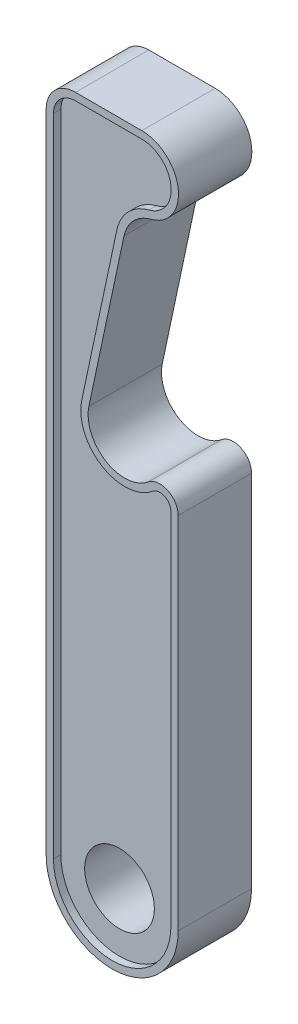
ISO-10303-21;
HEADER;
FILE_DESCRIPTION(('STEP AP214'),'2;1');
FILE_NAME('part.step','',(''),(''),'','','');
FILE_SCHEMA(('AUTOMOTIVE_DESIGN { 1 0 10303 214 1 1 1 1 }'));
ENDSEC;
DATA;
#1=APPLICATION_CONTEXT('core data for automotive mechanical design processes');
#2=APPLICATION_PROTOCOL_DEFINITION('international standard','automotive_design',2000,#1);
#3=PRODUCT_CONTEXT('',#1,'mechanical');
#4=PRODUCT('Part','Part','',(#3));
#5=PRODUCT_RELATED_PRODUCT_CATEGORY('part','',(#4));
#6=PRODUCT_DEFINITION_FORMATION('','',#4);
#7=PRODUCT_DEFINITION_CONTEXT('part definition',#1,'design');
#8=PRODUCT_DEFINITION('design','',#6,#7);
#9=PRODUCT_DEFINITION_SHAPE('','',#8);
#10=(LENGTH_UNIT() NAMED_UNIT(*) SI_UNIT(.MILLI.,.METRE.));
#11=(NAMED_UNIT(*) PLANE_ANGLE_UNIT() SI_UNIT($,.RADIAN.));
#12=(NAMED_UNIT(*) SI_UNIT($,.STERADIAN.) SOLID_ANGLE_UNIT());
#13=UNCERTAINTY_MEASURE_WITH_UNIT(LENGTH_MEASURE(1.E-05),#10,'distance_accuracy_value','');
#14=(GEOMETRIC_REPRESENTATION_CONTEXT(3) GLOBAL_UNCERTAINTY_ASSIGNED_CONTEXT((#13)) GLOBAL_UNIT_ASSIGNED_CONTEXT((#10,
#11,#12)) REPRESENTATION_CONTEXT('',''));
#15=CARTESIAN_POINT('',(0.,0.,0.));
#16=DIRECTION('',(0.,0.,1.));
#17=DIRECTION('',(1.,0.,0.));
#18=AXIS2_PLACEMENT_3D('',#15,#16,#17);
#19=CARTESIAN_POINT('',(0.,0.,4.5));
#20=DIRECTION('',(0.,0.,-1.));
#21=DIRECTION('',(-1.,0.,0.));
#22=AXIS2_PLACEMENT_3D('',#19,#20,#21);
#23=CYLINDRICAL_SURFACE('',#22,4.75);
#24=CARTESIAN_POINT('',(0.,0.,4.5));
#25=DIRECTION('',(0.,0.,1.));
#26=DIRECTION('',(1.,0.,0.));
#27=AXIS2_PLACEMENT_3D('',#24,#25,#26);
#28=CIRCLE('',#27,4.75);
#29=CARTESIAN_POINT('',(4.75,0.,4.5));
#30=VERTEX_POINT('',#29);
#31=EDGE_CURVE('E370',#30,#30,#28,.T.);
#32=ORIENTED_EDGE('',*,*,#31,.T.);
#33=EDGE_LOOP('',(#32));
#34=FACE_BOUND('',#33,.T.);
#35=CARTESIAN_POINT('',(0.,0.,-4.5));
#36=DIRECTION('',(0.,0.,1.));
#37=DIRECTION('',(1.,0.,0.));
#38=AXIS2_PLACEMENT_3D('',#35,#36,#37);
#39=CIRCLE('',#38,4.75);
#40=CARTESIAN_POINT('',(4.75,0.,-4.5));
#41=VERTEX_POINT('',#40);
#42=EDGE_CURVE('E102',#41,#41,#39,.T.);
#43=ORIENTED_EDGE('',*,*,#42,.F.);
#44=EDGE_LOOP('',(#43));
#45=FACE_BOUND('',#44,.T.);
#46=ADVANCED_FACE('F99',(#34,#45),#23,.F.);
#47=CARTESIAN_POINT('',(0.,0.,4.5));
#48=DIRECTION('',(0.,0.,1.));
#49=DIRECTION('',(1.,0.,0.));
#50=AXIS2_PLACEMENT_3D('',#47,#48,#49);
#51=PLANE('',#50);
#52=ORIENTED_EDGE('',*,*,#31,.F.);
#53=EDGE_LOOP('',(#52));
#54=FACE_BOUND('',#53,.T.);
#55=DIRECTION('',(0.,1.,0.));
#56=VECTOR('',#55,1.);
#57=CARTESIAN_POINT('',(-8.,0.,4.5));
#58=LINE('',#57,#56);
#59=CARTESIAN_POINT('',(-8.,0.,4.5));
#60=VERTEX_POINT('',#59);
#61=CARTESIAN_POINT('',(-8.,88.,4.5));
#62=VERTEX_POINT('',#61);
#63=EDGE_CURVE('E373',#60,#62,#58,.T.);
#64=ORIENTED_EDGE('',*,*,#63,.F.);
#65=CARTESIAN_POINT('',(0.,0.,4.5));
#66=DIRECTION('',(0.,0.,1.));
#67=DIRECTION('',(1.,0.,0.));
#68=AXIS2_PLACEMENT_3D('',#65,#66,#67);
#69=CIRCLE('',#68,8.);
#70=CARTESIAN_POINT('',(8.,0.,4.5));
#71=VERTEX_POINT('',#70);
#72=EDGE_CURVE('E375',#60,#71,#69,.T.);
#73=ORIENTED_EDGE('',*,*,#72,.T.);
#74=DIRECTION('',(0.,1.,0.));
#75=VECTOR('',#74,1.);
#76=CARTESIAN_POINT('',(8.,0.,4.5));
#77=LINE('',#76,#75);
#78=CARTESIAN_POINT('',(7.99999999999999,49.0303312216235,4.5));
#79=VERTEX_POINT('',#78);
#80=EDGE_CURVE('E378',#71,#79,#77,.T.);
#81=ORIENTED_EDGE('',*,*,#80,.T.);
#82=CARTESIAN_POINT('',(6.49999999999999,49.0303312216235,4.5));
#83=DIRECTION('',(0.,0.,1.));
#84=DIRECTION('',(1.,0.,0.));
#85=AXIS2_PLACEMENT_3D('',#82,#83,#84);
#86=CIRCLE('',#85,1.5);
#87=CARTESIAN_POINT('',(5.54349547248489,50.185796101593,4.5));
#88=VERTEX_POINT('',#87);
#89=EDGE_CURVE('E381',#79,#88,#86,.T.);
#90=ORIENTED_EDGE('',*,*,#89,.T.);
#91=CARTESIAN_POINT('',(1.71747736242449,54.8076556214714,4.5));
#92=DIRECTION('',(0.,0.,1.));
#93=DIRECTION('',(1.,0.,0.));
#94=AXIS2_PLACEMENT_3D('',#91,#92,#93);
#95=CIRCLE('',#94,6.);
#96=CARTESIAN_POINT('',(-4.15140824197834,56.0551257663779,4.5));
#97=VERTEX_POINT('',#96);
#98=EDGE_CURVE('E122',#88,#97,#95,.F.);
#99=ORIENTED_EDGE('',*,*,#98,.T.);
#100=DIRECTION('',(0.20791169081776,0.978147600733806,0.));
#101=VECTOR('',#100,1.);
#102=CARTESIAN_POINT('',(-15.3717910328331,3.26737504864908,4.5));
#103=LINE('',#102,#101);
#104=CARTESIAN_POINT('',(0.631114395597164,78.5551257663779,4.5));
#105=VERTEX_POINT('',#104);
#106=EDGE_CURVE('E384',#97,#105,#103,.T.);
#107=ORIENTED_EDGE('',*,*,#106,.T.);
#108=CARTESIAN_POINT('',(6.49999999999999,77.3076556214714,4.5));
#109=DIRECTION('',(0.,0.,1.));
#110=DIRECTION('',(1.,0.,0.));
#111=AXIS2_PLACEMENT_3D('',#108,#109,#110);
#112=CIRCLE('',#111,5.99999999999999);
#113=CARTESIAN_POINT('',(5.02316359698118,83.1230622485886,4.5));
#114=VERTEX_POINT('',#113);
#115=EDGE_CURVE('E387',#105,#114,#112,.F.);
#116=ORIENTED_EDGE('',*,*,#115,.T.);
#117=CARTESIAN_POINT('',(4.03860599496866,87.,4.5));
#118=DIRECTION('',(0.,0.,1.));
#119=DIRECTION('',(1.,0.,0.));
#120=AXIS2_PLACEMENT_3D('',#117,#118,#119);
#121=CIRCLE('',#120,3.99999999999999);
#122=CARTESIAN_POINT('',(4.03860599496866,91.,4.5));
#123=VERTEX_POINT('',#122);
#124=EDGE_CURVE('E390',#114,#123,#121,.T.);
#125=ORIENTED_EDGE('',*,*,#124,.T.);
#126=DIRECTION('',(1.,0.,0.));
#127=VECTOR('',#126,1.);
#128=CARTESIAN_POINT('',(0.,91.,4.5));
#129=LINE('',#128,#127);
#130=CARTESIAN_POINT('',(-5.,91.,4.5));
#131=VERTEX_POINT('',#130);
#132=EDGE_CURVE('E107',#131,#123,#129,.T.);
#133=ORIENTED_EDGE('',*,*,#132,.F.);
#134=CARTESIAN_POINT('',(-5.,88.,4.5));
#135=DIRECTION('',(0.,0.,1.));
#136=DIRECTION('',(1.,0.,0.));
#137=AXIS2_PLACEMENT_3D('',#134,#135,#136);
#138=CIRCLE('',#137,3.);
#139=EDGE_CURVE('E12',#62,#131,#138,.F.);
#140=ORIENTED_EDGE('',*,*,#139,.F.);
#141=EDGE_LOOP('',(#64,#73,#81,#90,#99,#107,#116,#125,#133,#140));
#142=FACE_BOUND('',#141,.T.);
#143=ADVANCED_FACE('F404',(#54,#142),#51,.T.);
#144=CARTESIAN_POINT('',(0.,0.,-4.5));
#145=DIRECTION('',(0.,0.,1.));
#146=DIRECTION('',(1.,0.,0.));
#147=AXIS2_PLACEMENT_3D('',#144,#145,#146);
#148=PLANE('',#147);
#149=ORIENTED_EDGE('',*,*,#42,.T.);
#150=EDGE_LOOP('',(#149));
#151=FACE_BOUND('',#150,.T.);
#152=CARTESIAN_POINT('',(4.03860599496866,87.,-4.5));
#153=DIRECTION('',(0.,0.,1.));
#154=DIRECTION('',(1.,0.,0.));
#155=AXIS2_PLACEMENT_3D('',#152,#153,#154);
#156=CIRCLE('',#155,5.);
#157=CARTESIAN_POINT('',(5.26930299748432,82.1538278107357,-4.5));
#158=VERTEX_POINT('',#157);
#159=CARTESIAN_POINT('',(4.03860599496866,92.,-4.5));
#160=VERTEX_POINT('',#159);
#161=EDGE_CURVE('E248',#158,#160,#156,.T.);
#162=ORIENTED_EDGE('',*,*,#161,.F.);
#163=CARTESIAN_POINT('',(6.49999999999999,77.3076556214714,-4.5));
#164=DIRECTION('',(0.,0.,1.));
#165=DIRECTION('',(1.,0.,0.));
#166=AXIS2_PLACEMENT_3D('',#163,#164,#165);
#167=CIRCLE('',#166,5.);
#168=CARTESIAN_POINT('',(1.60926199633096,78.3472140755602,-4.5));
#169=VERTEX_POINT('',#168);
#170=EDGE_CURVE('E300',#158,#169,#167,.T.);
#171=ORIENTED_EDGE('',*,*,#170,.T.);
#172=DIRECTION('',(0.207911690817759,0.978147600733806,0.));
#173=VECTOR('',#172,1.);
#174=CARTESIAN_POINT('',(-14.3936434320992,3.05946335783131,-4.5));
#175=LINE('',#174,#173);
#176=CARTESIAN_POINT('',(-3.17326064124454,55.8472140755602,-4.5));
#177=VERTEX_POINT('',#176);
#178=EDGE_CURVE('E344',#177,#169,#175,.T.);
#179=ORIENTED_EDGE('',*,*,#178,.F.);
#180=CARTESIAN_POINT('',(1.71747736242449,54.8076556214714,-4.5));
#181=DIRECTION('',(0.,0.,1.));
#182=DIRECTION('',(1.,0.,0.));
#183=AXIS2_PLACEMENT_3D('',#180,#181,#182);
#184=CIRCLE('',#183,5.);
#185=CARTESIAN_POINT('',(4.90582578747482,50.9561060215728,-4.5));
#186=VERTEX_POINT('',#185);
#187=EDGE_CURVE('E341',#177,#186,#184,.T.);
#188=ORIENTED_EDGE('',*,*,#187,.T.);
#189=CARTESIAN_POINT('',(6.49999999999999,49.0303312216235,-4.5));
#190=DIRECTION('',(0.,0.,1.));
#191=DIRECTION('',(1.,0.,0.));
#192=AXIS2_PLACEMENT_3D('',#189,#190,#191);
#193=CIRCLE('',#192,2.5);
#194=CARTESIAN_POINT('',(8.99999999999999,49.0303312216235,-4.5));
#195=VERTEX_POINT('',#194);
#196=EDGE_CURVE('E338',#195,#186,#193,.T.);
#197=ORIENTED_EDGE('',*,*,#196,.F.);
#198=DIRECTION('',(0.,1.,0.));
#199=VECTOR('',#198,1.);
#200=CARTESIAN_POINT('',(9.,0.,-4.5));
#201=LINE('',#200,#199);
#202=CARTESIAN_POINT('',(9.,0.,-4.5));
#203=VERTEX_POINT('',#202);
#204=EDGE_CURVE('E336',#203,#195,#201,.T.);
#205=ORIENTED_EDGE('',*,*,#204,.F.);
#206=CARTESIAN_POINT('',(0.,0.,-4.5));
#207=DIRECTION('',(0.,0.,1.));
#208=DIRECTION('',(1.,0.,0.));
#209=AXIS2_PLACEMENT_3D('',#206,#207,#208);
#210=CIRCLE('',#209,9.);
#211=CARTESIAN_POINT('',(-9.,0.,-4.5));
#212=VERTEX_POINT('',#211);
#213=EDGE_CURVE('E334',#212,#203,#210,.T.);
#214=ORIENTED_EDGE('',*,*,#213,.F.);
#215=DIRECTION('',(0.,1.,0.));
#216=VECTOR('',#215,1.);
#217=CARTESIAN_POINT('',(-9.,0.,-4.5));
#218=LINE('',#217,#216);
#219=CARTESIAN_POINT('',(-9.,88.,-4.5));
#220=VERTEX_POINT('',#219);
#221=EDGE_CURVE('E331',#212,#220,#218,.T.);
#222=ORIENTED_EDGE('',*,*,#221,.T.);
#223=CARTESIAN_POINT('',(-5.,88.,-4.5));
#224=DIRECTION('',(0.,0.,1.));
#225=DIRECTION('',(1.,0.,0.));
#226=AXIS2_PLACEMENT_3D('',#223,#224,#225);
#227=CIRCLE('',#226,4.);
#228=CARTESIAN_POINT('',(-5.,92.,-4.5));
#229=VERTEX_POINT('',#228);
#230=EDGE_CURVE('E328',#229,#220,#227,.T.);
#231=ORIENTED_EDGE('',*,*,#230,.F.);
#232=DIRECTION('',(1.,0.,0.));
#233=VECTOR('',#232,1.);
#234=CARTESIAN_POINT('',(-1.41255905947182E-13,92.,-4.5));
#235=LINE('',#234,#233);
#236=EDGE_CURVE('E325',#229,#160,#235,.T.);
#237=ORIENTED_EDGE('',*,*,#236,.T.);
#238=EDGE_LOOP('',(#162,#171,#179,#188,#197,#205,#214,#222,#231,#237));
#239=FACE_BOUND('',#238,.T.);
#240=ADVANCED_FACE('F435',(#151,#239),#148,.F.);
#241=CARTESIAN_POINT('',(4.03860599496866,87.,5.5));
#242=DIRECTION('',(0.,0.,1.));
#243=DIRECTION('',(1.,0.,0.));
#244=AXIS2_PLACEMENT_3D('',#241,#242,#243);
#245=PLANE('',#244);
#246=CARTESIAN_POINT('',(4.03860599496866,87.,5.5));
#247=DIRECTION('',(0.,0.,1.));
#248=DIRECTION('',(1.,0.,0.));
#249=AXIS2_PLACEMENT_3D('',#246,#247,#248);
#250=CIRCLE('',#249,5.);
#251=CARTESIAN_POINT('',(5.26930299748432,82.1538278107357,5.5));
#252=VERTEX_POINT('',#251);
#253=CARTESIAN_POINT('',(4.03860599496866,92.,5.5));
#254=VERTEX_POINT('',#253);
#255=EDGE_CURVE('E297',#252,#254,#250,.T.);
#256=ORIENTED_EDGE('',*,*,#255,.T.);
#257=DIRECTION('',(1.,0.,0.));
#258=VECTOR('',#257,1.);
#259=CARTESIAN_POINT('',(-1.41255905947182E-13,92.,5.5));
#260=LINE('',#259,#258);
#261=CARTESIAN_POINT('',(-5.,92.,5.5));
#262=VERTEX_POINT('',#261);
#263=EDGE_CURVE('E299',#262,#254,#260,.T.);
#264=ORIENTED_EDGE('',*,*,#263,.F.);
#265=CARTESIAN_POINT('',(-5.,88.,5.5));
#266=DIRECTION('',(0.,0.,1.));
#267=DIRECTION('',(1.,0.,0.));
#268=AXIS2_PLACEMENT_3D('',#265,#266,#267);
#269=CIRCLE('',#268,4.);
#270=CARTESIAN_POINT('',(-9.,88.,5.5));
#271=VERTEX_POINT('',#270);
#272=EDGE_CURVE('E303',#262,#271,#269,.T.);
#273=ORIENTED_EDGE('',*,*,#272,.T.);
#274=DIRECTION('',(0.,1.,0.));
#275=VECTOR('',#274,1.);
#276=CARTESIAN_POINT('',(-9.,0.,5.5));
#277=LINE('',#276,#275);
#278=CARTESIAN_POINT('',(-9.,0.,5.5));
#279=VERTEX_POINT('',#278);
#280=EDGE_CURVE('E305',#279,#271,#277,.T.);
#281=ORIENTED_EDGE('',*,*,#280,.F.);
#282=CARTESIAN_POINT('',(0.,0.,5.5));
#283=DIRECTION('',(0.,0.,1.));
#284=DIRECTION('',(1.,0.,0.));
#285=AXIS2_PLACEMENT_3D('',#282,#283,#284);
#286=CIRCLE('',#285,9.);
#287=CARTESIAN_POINT('',(9.,0.,5.5));
#288=VERTEX_POINT('',#287);
#289=EDGE_CURVE('E308',#279,#288,#286,.T.);
#290=ORIENTED_EDGE('',*,*,#289,.T.);
#291=DIRECTION('',(0.,1.,0.));
#292=VECTOR('',#291,1.);
#293=CARTESIAN_POINT('',(9.,0.,5.5));
#294=LINE('',#293,#292);
#295=CARTESIAN_POINT('',(8.99999999999999,49.0303312216235,5.5));
#296=VERTEX_POINT('',#295);
#297=EDGE_CURVE('E310',#288,#296,#294,.T.);
#298=ORIENTED_EDGE('',*,*,#297,.T.);
#299=CARTESIAN_POINT('',(6.49999999999999,49.0303312216235,5.5));
#300=DIRECTION('',(0.,0.,1.));
#301=DIRECTION('',(1.,0.,0.));
#302=AXIS2_PLACEMENT_3D('',#299,#300,#301);
#303=CIRCLE('',#302,2.5);
#304=CARTESIAN_POINT('',(4.90582578747482,50.9561060215728,5.5));
#305=VERTEX_POINT('',#304);
#306=EDGE_CURVE('E312',#296,#305,#303,.T.);
#307=ORIENTED_EDGE('',*,*,#306,.T.);
#308=CARTESIAN_POINT('',(1.71747736242449,54.8076556214714,5.5));
#309=DIRECTION('',(0.,0.,1.));
#310=DIRECTION('',(1.,0.,0.));
#311=AXIS2_PLACEMENT_3D('',#308,#309,#310);
#312=CIRCLE('',#311,5.);
#313=CARTESIAN_POINT('',(-3.17326064124454,55.8472140755602,5.5));
#314=VERTEX_POINT('',#313);
#315=EDGE_CURVE('E314',#314,#305,#312,.T.);
#316=ORIENTED_EDGE('',*,*,#315,.F.);
#317=DIRECTION('',(0.207911690817759,0.978147600733806,0.));
#318=VECTOR('',#317,1.);
#319=CARTESIAN_POINT('',(-14.3936434320992,3.05946335783131,5.5));
#320=LINE('',#319,#318);
#321=CARTESIAN_POINT('',(1.60926199633096,78.3472140755602,5.5));
#322=VERTEX_POINT('',#321);
#323=EDGE_CURVE('E317',#314,#322,#320,.T.);
#324=ORIENTED_EDGE('',*,*,#323,.T.);
#325=CARTESIAN_POINT('',(6.49999999999999,77.3076556214714,5.5));
#326=DIRECTION('',(0.,0.,1.));
#327=DIRECTION('',(1.,0.,0.));
#328=AXIS2_PLACEMENT_3D('',#325,#326,#327);
#329=CIRCLE('',#328,5.);
#330=EDGE_CURVE('E319',#252,#322,#329,.T.);
#331=ORIENTED_EDGE('',*,*,#330,.F.);
#332=EDGE_LOOP('',(#256,#264,#273,#281,#290,#298,#307,#316,#324,#331));
#333=FACE_BOUND('',#332,.T.);
#334=CARTESIAN_POINT('',(1.71747736242449,54.8076556214714,5.5));
#335=DIRECTION('',(0.,0.,1.));
#336=DIRECTION('',(1.,0.,0.));
#337=AXIS2_PLACEMENT_3D('',#334,#335,#336);
#338=CIRCLE('',#337,6.);
#339=CARTESIAN_POINT('',(-4.15140824197834,56.0551257663779,5.5));
#340=VERTEX_POINT('',#339);
#341=CARTESIAN_POINT('',(5.54349547248489,50.185796101593,5.5));
#342=VERTEX_POINT('',#341);
#343=EDGE_CURVE('E243',#340,#342,#338,.T.);
#344=ORIENTED_EDGE('',*,*,#343,.T.);
#345=CARTESIAN_POINT('',(6.49999999999999,49.0303312216235,5.5));
#346=DIRECTION('',(0.,0.,1.));
#347=DIRECTION('',(1.,0.,0.));
#348=AXIS2_PLACEMENT_3D('',#345,#346,#347);
#349=CIRCLE('',#348,1.5);
#350=CARTESIAN_POINT('',(7.99999999999999,49.0303312216235,5.5));
#351=VERTEX_POINT('',#350);
#352=EDGE_CURVE('E236',#351,#342,#349,.T.);
#353=ORIENTED_EDGE('',*,*,#352,.F.);
#354=DIRECTION('',(0.,1.,0.));
#355=VECTOR('',#354,1.);
#356=CARTESIAN_POINT('',(8.,0.,5.5));
#357=LINE('',#356,#355);
#358=CARTESIAN_POINT('',(8.,0.,5.5));
#359=VERTEX_POINT('',#358);
#360=EDGE_CURVE('E272',#359,#351,#357,.T.);
#361=ORIENTED_EDGE('',*,*,#360,.F.);
#362=CARTESIAN_POINT('',(0.,0.,5.5));
#363=DIRECTION('',(0.,0.,1.));
#364=DIRECTION('',(1.,0.,0.));
#365=AXIS2_PLACEMENT_3D('',#362,#363,#364);
#366=CIRCLE('',#365,8.);
#367=CARTESIAN_POINT('',(-8.,0.,5.5));
#368=VERTEX_POINT('',#367);
#369=EDGE_CURVE('E269',#368,#359,#366,.T.);
#370=ORIENTED_EDGE('',*,*,#369,.F.);
#371=DIRECTION('',(0.,1.,0.));
#372=VECTOR('',#371,1.);
#373=CARTESIAN_POINT('',(-8.,0.,5.5));
#374=LINE('',#373,#372);
#375=CARTESIAN_POINT('',(-8.,88.,5.5));
#376=VERTEX_POINT('',#375);
#377=EDGE_CURVE('E266',#368,#376,#374,.T.);
#378=ORIENTED_EDGE('',*,*,#377,.T.);
#379=CARTESIAN_POINT('',(-5.,88.,5.5));
#380=DIRECTION('',(0.,0.,1.));
#381=DIRECTION('',(1.,0.,0.));
#382=AXIS2_PLACEMENT_3D('',#379,#380,#381);
#383=CIRCLE('',#382,3.);
#384=CARTESIAN_POINT('',(-5.,91.,5.5));
#385=VERTEX_POINT('',#384);
#386=EDGE_CURVE('E264',#385,#376,#383,.T.);
#387=ORIENTED_EDGE('',*,*,#386,.F.);
#388=DIRECTION('',(1.,0.,0.));
#389=VECTOR('',#388,1.);
#390=CARTESIAN_POINT('',(0.,91.,5.5));
#391=LINE('',#390,#389);
#392=CARTESIAN_POINT('',(4.03860599496866,91.,5.5));
#393=VERTEX_POINT('',#392);
#394=EDGE_CURVE('E261',#385,#393,#391,.T.);
#395=ORIENTED_EDGE('',*,*,#394,.T.);
#396=CARTESIAN_POINT('',(4.03860599496866,87.,5.5));
#397=DIRECTION('',(0.,0.,1.));
#398=DIRECTION('',(1.,0.,0.));
#399=AXIS2_PLACEMENT_3D('',#396,#397,#398);
#400=CIRCLE('',#399,3.99999999999999);
#401=CARTESIAN_POINT('',(5.02316359698118,83.1230622485886,5.5));
#402=VERTEX_POINT('',#401);
#403=EDGE_CURVE('E259',#402,#393,#400,.T.);
#404=ORIENTED_EDGE('',*,*,#403,.F.);
#405=CARTESIAN_POINT('',(6.49999999999999,77.3076556214714,5.5));
#406=DIRECTION('',(0.,0.,1.));
#407=DIRECTION('',(1.,0.,0.));
#408=AXIS2_PLACEMENT_3D('',#405,#406,#407);
#409=CIRCLE('',#408,5.99999999999999);
#410=CARTESIAN_POINT('',(0.631114395597164,78.5551257663779,5.5));
#411=VERTEX_POINT('',#410);
#412=EDGE_CURVE('E255',#402,#411,#409,.T.);
#413=ORIENTED_EDGE('',*,*,#412,.T.);
#414=DIRECTION('',(0.20791169081776,0.978147600733806,0.));
#415=VECTOR('',#414,1.);
#416=CARTESIAN_POINT('',(-15.371791032833,3.26737504864908,5.5));
#417=LINE('',#416,#415);
#418=EDGE_CURVE('E253',#340,#411,#417,.T.);
#419=ORIENTED_EDGE('',*,*,#418,.F.);
#420=EDGE_LOOP('',(#344,#353,#361,#370,#378,#387,#395,#404,#413,#419));
#421=FACE_BOUND('',#420,.T.);
#422=ADVANCED_FACE('F251',(#333,#421),#245,.T.);
#423=CARTESIAN_POINT('',(4.03860599496866,87.,5.5));
#424=DIRECTION('',(0.,0.,-1.));
#425=DIRECTION('',(-1.,0.,0.));
#426=AXIS2_PLACEMENT_3D('',#423,#424,#425);
#427=CYLINDRICAL_SURFACE('',#426,5.);
#428=ORIENTED_EDGE('',*,*,#161,.T.);
#429=DIRECTION('',(0.,0.,-1.));
#430=VECTOR('',#429,1.);
#431=CARTESIAN_POINT('',(4.03860599496866,92.,5.5));
#432=LINE('',#431,#430);
#433=EDGE_CURVE('E368',#254,#160,#432,.T.);
#434=ORIENTED_EDGE('',*,*,#433,.F.);
#435=ORIENTED_EDGE('',*,*,#255,.F.);
#436=DIRECTION('',(0.,0.,-1.));
#437=VECTOR('',#436,1.);
#438=CARTESIAN_POINT('',(5.26930299748432,82.1538278107357,5.5));
#439=LINE('',#438,#437);
#440=EDGE_CURVE('E322',#252,#158,#439,.T.);
#441=ORIENTED_EDGE('',*,*,#440,.T.);
#442=EDGE_LOOP('',(#428,#434,#435,#441));
#443=FACE_BOUND('',#442,.T.);
#444=ADVANCED_FACE('F489',(#443),#427,.T.);
#445=CARTESIAN_POINT('',(-1.41255905947182E-13,92.,5.5));
#446=DIRECTION('',(0.,1.,0.));
#447=DIRECTION('',(-1.,0.,0.));
#448=AXIS2_PLACEMENT_3D('',#445,#446,#447);
#449=PLANE('',#448);
#450=ORIENTED_EDGE('',*,*,#236,.F.);
#451=DIRECTION('',(0.,0.,-1.));
#452=VECTOR('',#451,1.);
#453=CARTESIAN_POINT('',(-5.,92.,5.5));
#454=LINE('',#453,#452);
#455=EDGE_CURVE('E366',#262,#229,#454,.T.);
#456=ORIENTED_EDGE('',*,*,#455,.F.);
#457=ORIENTED_EDGE('',*,*,#263,.T.);
#458=ORIENTED_EDGE('',*,*,#433,.T.);
#459=EDGE_LOOP('',(#450,#456,#457,#458));
#460=FACE_BOUND('',#459,.T.);
#461=ADVANCED_FACE('F486',(#460),#449,.T.);
#462=CARTESIAN_POINT('',(-5.,88.,5.5));
#463=DIRECTION('',(0.,0.,-1.));
#464=DIRECTION('',(-1.,0.,0.));
#465=AXIS2_PLACEMENT_3D('',#462,#463,#464);
#466=CYLINDRICAL_SURFACE('',#465,4.);
#467=ORIENTED_EDGE('',*,*,#230,.T.);
#468=DIRECTION('',(0.,0.,-1.));
#469=VECTOR('',#468,1.);
#470=CARTESIAN_POINT('',(-9.,88.,5.5));
#471=LINE('',#470,#469);
#472=EDGE_CURVE('E364',#271,#220,#471,.T.);
#473=ORIENTED_EDGE('',*,*,#472,.F.);
#474=ORIENTED_EDGE('',*,*,#272,.F.);
#475=ORIENTED_EDGE('',*,*,#455,.T.);
#476=EDGE_LOOP('',(#467,#473,#474,#475));
#477=FACE_BOUND('',#476,.T.);
#478=ADVANCED_FACE('F491',(#477),#466,.T.);
#479=CARTESIAN_POINT('',(-9.,0.,5.5));
#480=DIRECTION('',(-1.,0.,0.));
#481=DIRECTION('',(0.,-1.,0.));
#482=AXIS2_PLACEMENT_3D('',#479,#480,#481);
#483=PLANE('',#482);
#484=ORIENTED_EDGE('',*,*,#221,.F.);
#485=DIRECTION('',(0.,0.,-1.));
#486=VECTOR('',#485,1.);
#487=CARTESIAN_POINT('',(-9.,0.,5.5));
#488=LINE('',#487,#486);
#489=EDGE_CURVE('E362',#279,#212,#488,.T.);
#490=ORIENTED_EDGE('',*,*,#489,.F.);
#491=ORIENTED_EDGE('',*,*,#280,.T.);
#492=ORIENTED_EDGE('',*,*,#472,.T.);
#493=EDGE_LOOP('',(#484,#490,#491,#492));
#494=FACE_BOUND('',#493,.T.);
#495=ADVANCED_FACE('F482',(#494),#483,.T.);
#496=CARTESIAN_POINT('',(0.,0.,5.5));
#497=DIRECTION('',(0.,0.,-1.));
#498=DIRECTION('',(-1.,0.,0.));
#499=AXIS2_PLACEMENT_3D('',#496,#497,#498);
#500=CYLINDRICAL_SURFACE('',#499,9.);
#501=ORIENTED_EDGE('',*,*,#213,.T.);
#502=DIRECTION('',(0.,0.,-1.));
#503=VECTOR('',#502,1.);
#504=CARTESIAN_POINT('',(9.,0.,5.5));
#505=LINE('',#504,#503);
#506=EDGE_CURVE('E359',#288,#203,#505,.T.);
#507=ORIENTED_EDGE('',*,*,#506,.F.);
#508=ORIENTED_EDGE('',*,*,#289,.F.);
#509=ORIENTED_EDGE('',*,*,#489,.T.);
#510=EDGE_LOOP('',(#501,#507,#508,#509));
#511=FACE_BOUND('',#510,.T.);
#512=ADVANCED_FACE('F479',(#511),#500,.T.);
#513=CARTESIAN_POINT('',(9.,0.,5.5));
#514=DIRECTION('',(-1.,0.,0.));
#515=DIRECTION('',(0.,-1.,0.));
#516=AXIS2_PLACEMENT_3D('',#513,#514,#515);
#517=PLANE('',#516);
#518=ORIENTED_EDGE('',*,*,#204,.T.);
#519=DIRECTION('',(0.,0.,-1.));
#520=VECTOR('',#519,1.);
#521=CARTESIAN_POINT('',(8.99999999999999,49.0303312216235,5.5));
#522=LINE('',#521,#520);
#523=EDGE_CURVE('E356',#296,#195,#522,.T.);
#524=ORIENTED_EDGE('',*,*,#523,.F.);
#525=ORIENTED_EDGE('',*,*,#297,.F.);
#526=ORIENTED_EDGE('',*,*,#506,.T.);
#527=EDGE_LOOP('',(#518,#524,#525,#526));
#528=FACE_BOUND('',#527,.T.);
#529=ADVANCED_FACE('F474',(#528),#517,.F.);
#530=CARTESIAN_POINT('',(6.49999999999999,49.0303312216235,5.5));
#531=DIRECTION('',(0.,0.,-1.));
#532=DIRECTION('',(-1.,0.,0.));
#533=AXIS2_PLACEMENT_3D('',#530,#531,#532);
#534=CYLINDRICAL_SURFACE('',#533,2.5);
#535=ORIENTED_EDGE('',*,*,#196,.T.);
#536=DIRECTION('',(0.,0.,-1.));
#537=VECTOR('',#536,1.);
#538=CARTESIAN_POINT('',(4.90582578747482,50.9561060215728,5.5));
#539=LINE('',#538,#537);
#540=EDGE_CURVE('E354',#305,#186,#539,.T.);
#541=ORIENTED_EDGE('',*,*,#540,.F.);
#542=ORIENTED_EDGE('',*,*,#306,.F.);
#543=ORIENTED_EDGE('',*,*,#523,.T.);
#544=EDGE_LOOP('',(#535,#541,#542,#543));
#545=FACE_BOUND('',#544,.T.);
#546=ADVANCED_FACE('F468',(#545),#534,.T.);
#547=CARTESIAN_POINT('',(1.71747736242449,54.8076556214714,5.5));
#548=DIRECTION('',(0.,0.,-1.));
#549=DIRECTION('',(-1.,0.,0.));
#550=AXIS2_PLACEMENT_3D('',#547,#548,#549);
#551=CYLINDRICAL_SURFACE('',#550,5.);
#552=ORIENTED_EDGE('',*,*,#187,.F.);
#553=DIRECTION('',(0.,0.,-1.));
#554=VECTOR('',#553,1.);
#555=CARTESIAN_POINT('',(-3.17326064124454,55.8472140755602,5.5));
#556=LINE('',#555,#554);
#557=EDGE_CURVE('E352',#314,#177,#556,.T.);
#558=ORIENTED_EDGE('',*,*,#557,.F.);
#559=ORIENTED_EDGE('',*,*,#315,.T.);
#560=ORIENTED_EDGE('',*,*,#540,.T.);
#561=EDGE_LOOP('',(#552,#558,#559,#560));
#562=FACE_BOUND('',#561,.T.);
#563=ADVANCED_FACE('F463',(#562),#551,.F.);
#564=CARTESIAN_POINT('',(-14.3936434320992,3.05946335783131,5.5));
#565=DIRECTION('',(-0.978147600733806,0.20791169081776,0.));
#566=DIRECTION('',(-0.20791169081776,-0.978147600733806,0.));
#567=AXIS2_PLACEMENT_3D('',#564,#565,#566);
#568=PLANE('',#567);
#569=ORIENTED_EDGE('',*,*,#178,.T.);
#570=DIRECTION('',(0.,0.,-1.));
#571=VECTOR('',#570,1.);
#572=CARTESIAN_POINT('',(1.60926199633096,78.3472140755602,5.5));
#573=LINE('',#572,#571);
#574=EDGE_CURVE('E350',#322,#169,#573,.T.);
#575=ORIENTED_EDGE('',*,*,#574,.F.);
#576=ORIENTED_EDGE('',*,*,#323,.F.);
#577=ORIENTED_EDGE('',*,*,#557,.T.);
#578=EDGE_LOOP('',(#569,#575,#576,#577));
#579=FACE_BOUND('',#578,.T.);
#580=ADVANCED_FACE('F459',(#579),#568,.F.);
#581=CARTESIAN_POINT('',(6.49999999999999,77.3076556214714,5.5));
#582=DIRECTION('',(0.,0.,-1.));
#583=DIRECTION('',(-1.,0.,0.));
#584=AXIS2_PLACEMENT_3D('',#581,#582,#583);
#585=CYLINDRICAL_SURFACE('',#584,5.);
#586=ORIENTED_EDGE('',*,*,#170,.F.);
#587=ORIENTED_EDGE('',*,*,#440,.F.);
#588=ORIENTED_EDGE('',*,*,#330,.T.);
#589=ORIENTED_EDGE('',*,*,#574,.T.);
#590=EDGE_LOOP('',(#586,#587,#588,#589));
#591=FACE_BOUND('',#590,.T.);
#592=ADVANCED_FACE('F453',(#591),#585,.F.);
#593=CARTESIAN_POINT('',(6.49999999999999,49.0303312216235,5.5));
#594=DIRECTION('',(0.,0.,-1.));
#595=DIRECTION('',(-1.,0.,0.));
#596=AXIS2_PLACEMENT_3D('',#593,#594,#595);
#597=CYLINDRICAL_SURFACE('',#596,1.5);
#598=DIRECTION('',(0.,0.,-1.));
#599=VECTOR('',#598,1.);
#600=CARTESIAN_POINT('',(5.54349547248489,50.185796101593,5.5));
#601=LINE('',#600,#599);
#602=EDGE_CURVE('E238',#342,#88,#601,.T.);
#603=ORIENTED_EDGE('',*,*,#602,.T.);
#604=ORIENTED_EDGE('',*,*,#89,.F.);
#605=DIRECTION('',(0.,0.,-1.));
#606=VECTOR('',#605,1.);
#607=CARTESIAN_POINT('',(7.99999999999999,49.0303312216235,5.5));
#608=LINE('',#607,#606);
#609=EDGE_CURVE('E114',#351,#79,#608,.T.);
#610=ORIENTED_EDGE('',*,*,#609,.F.);
#611=ORIENTED_EDGE('',*,*,#352,.T.);
#612=EDGE_LOOP('',(#603,#604,#610,#611));
#613=FACE_BOUND('',#612,.T.);
#614=ADVANCED_FACE('F237',(#613),#597,.F.);
#615=CARTESIAN_POINT('',(1.71747736242449,54.8076556214714,5.5));
#616=DIRECTION('',(0.,0.,-1.));
#617=DIRECTION('',(-1.,0.,0.));
#618=AXIS2_PLACEMENT_3D('',#615,#616,#617);
#619=CYLINDRICAL_SURFACE('',#618,6.);
#620=ORIENTED_EDGE('',*,*,#98,.F.);
#621=ORIENTED_EDGE('',*,*,#602,.F.);
#622=ORIENTED_EDGE('',*,*,#343,.F.);
#623=DIRECTION('',(0.,0.,-1.));
#624=VECTOR('',#623,1.);
#625=CARTESIAN_POINT('',(-4.15140824197834,56.0551257663779,5.5));
#626=LINE('',#625,#624);
#627=EDGE_CURVE('E249',#340,#97,#626,.T.);
#628=ORIENTED_EDGE('',*,*,#627,.T.);
#629=EDGE_LOOP('',(#620,#621,#622,#628));
#630=FACE_BOUND('',#629,.T.);
#631=ADVANCED_FACE('F246',(#630),#619,.T.);
#632=CARTESIAN_POINT('',(-15.371791032833,3.26737504864908,5.5));
#633=DIRECTION('',(-0.978147600733806,0.20791169081776,0.));
#634=DIRECTION('',(-0.20791169081776,-0.978147600733806,0.));
#635=AXIS2_PLACEMENT_3D('',#632,#633,#634);
#636=PLANE('',#635);
#637=DIRECTION('',(0.,0.,-1.));
#638=VECTOR('',#637,1.);
#639=CARTESIAN_POINT('',(0.631114395597164,78.5551257663779,5.5));
#640=LINE('',#639,#638);
#641=EDGE_CURVE('E293',#411,#105,#640,.T.);
#642=ORIENTED_EDGE('',*,*,#641,.T.);
#643=ORIENTED_EDGE('',*,*,#106,.F.);
#644=ORIENTED_EDGE('',*,*,#627,.F.);
#645=ORIENTED_EDGE('',*,*,#418,.T.);
#646=EDGE_LOOP('',(#642,#643,#644,#645));
#647=FACE_BOUND('',#646,.T.);
#648=ADVANCED_FACE('F410',(#647),#636,.T.);
#649=CARTESIAN_POINT('',(6.49999999999999,77.3076556214714,5.5));
#650=DIRECTION('',(0.,0.,-1.));
#651=DIRECTION('',(-1.,0.,0.));
#652=AXIS2_PLACEMENT_3D('',#649,#650,#651);
#653=CYLINDRICAL_SURFACE('',#652,5.99999999999999);
#654=ORIENTED_EDGE('',*,*,#115,.F.);
#655=ORIENTED_EDGE('',*,*,#641,.F.);
#656=ORIENTED_EDGE('',*,*,#412,.F.);
#657=DIRECTION('',(0.,0.,-1.));
#658=VECTOR('',#657,1.);
#659=CARTESIAN_POINT('',(5.02316359698118,83.1230622485886,5.5));
#660=LINE('',#659,#658);
#661=EDGE_CURVE('E290',#402,#114,#660,.T.);
#662=ORIENTED_EDGE('',*,*,#661,.T.);
#663=EDGE_LOOP('',(#654,#655,#656,#662));
#664=FACE_BOUND('',#663,.T.);
#665=ADVANCED_FACE('F407',(#664),#653,.T.);
#666=CARTESIAN_POINT('',(4.03860599496866,87.,5.5));
#667=DIRECTION('',(0.,0.,-1.));
#668=DIRECTION('',(-1.,0.,0.));
#669=AXIS2_PLACEMENT_3D('',#666,#667,#668);
#670=CYLINDRICAL_SURFACE('',#669,3.99999999999999);
#671=DIRECTION('',(0.,0.,-1.));
#672=VECTOR('',#671,1.);
#673=CARTESIAN_POINT('',(4.03860599496866,91.,5.5));
#674=LINE('',#673,#672);
#675=EDGE_CURVE('E287',#393,#123,#674,.T.);
#676=ORIENTED_EDGE('',*,*,#675,.T.);
#677=ORIENTED_EDGE('',*,*,#124,.F.);
#678=ORIENTED_EDGE('',*,*,#661,.F.);
#679=ORIENTED_EDGE('',*,*,#403,.T.);
#680=EDGE_LOOP('',(#676,#677,#678,#679));
#681=FACE_BOUND('',#680,.T.);
#682=ADVANCED_FACE('F401',(#681),#670,.F.);
#683=CARTESIAN_POINT('',(0.,91.,5.5));
#684=DIRECTION('',(0.,1.,0.));
#685=DIRECTION('',(0.,0.,1.));
#686=AXIS2_PLACEMENT_3D('',#683,#684,#685);
#687=PLANE('',#686);
#688=ORIENTED_EDGE('',*,*,#132,.T.);
#689=ORIENTED_EDGE('',*,*,#675,.F.);
#690=ORIENTED_EDGE('',*,*,#394,.F.);
#691=DIRECTION('',(0.,0.,-1.));
#692=VECTOR('',#691,1.);
#693=CARTESIAN_POINT('',(-5.,91.,5.5));
#694=LINE('',#693,#692);
#695=EDGE_CURVE('E284',#385,#131,#694,.T.);
#696=ORIENTED_EDGE('',*,*,#695,.T.);
#697=EDGE_LOOP('',(#688,#689,#690,#696));
#698=FACE_BOUND('',#697,.T.);
#699=ADVANCED_FACE('F396',(#698),#687,.F.);
#700=CARTESIAN_POINT('',(-5.,88.,5.5));
#701=DIRECTION('',(0.,0.,-1.));
#702=DIRECTION('',(-1.,0.,0.));
#703=AXIS2_PLACEMENT_3D('',#700,#701,#702);
#704=CYLINDRICAL_SURFACE('',#703,3.);
#705=DIRECTION('',(0.,0.,-1.));
#706=VECTOR('',#705,1.);
#707=CARTESIAN_POINT('',(-8.,88.,5.5));
#708=LINE('',#707,#706);
#709=EDGE_CURVE('E281',#376,#62,#708,.T.);
#710=ORIENTED_EDGE('',*,*,#709,.T.);
#711=ORIENTED_EDGE('',*,*,#139,.T.);
#712=ORIENTED_EDGE('',*,*,#695,.F.);
#713=ORIENTED_EDGE('',*,*,#386,.T.);
#714=EDGE_LOOP('',(#710,#711,#712,#713));
#715=FACE_BOUND('',#714,.T.);
#716=ADVANCED_FACE('F421',(#715),#704,.F.);
#717=CARTESIAN_POINT('',(-8.,0.,5.5));
#718=DIRECTION('',(-1.,0.,0.));
#719=DIRECTION('',(0.,0.,1.));
#720=AXIS2_PLACEMENT_3D('',#717,#718,#719);
#721=PLANE('',#720);
#722=ORIENTED_EDGE('',*,*,#63,.T.);
#723=ORIENTED_EDGE('',*,*,#709,.F.);
#724=ORIENTED_EDGE('',*,*,#377,.F.);
#725=DIRECTION('',(0.,0.,-1.));
#726=VECTOR('',#725,1.);
#727=CARTESIAN_POINT('',(-8.,0.,5.5));
#728=LINE('',#727,#726);
#729=EDGE_CURVE('E278',#368,#60,#728,.T.);
#730=ORIENTED_EDGE('',*,*,#729,.T.);
#731=EDGE_LOOP('',(#722,#723,#724,#730));
#732=FACE_BOUND('',#731,.T.);
#733=ADVANCED_FACE('F419',(#732),#721,.F.);
#734=CARTESIAN_POINT('',(0.,0.,5.5));
#735=DIRECTION('',(0.,0.,-1.));
#736=DIRECTION('',(-1.,0.,0.));
#737=AXIS2_PLACEMENT_3D('',#734,#735,#736);
#738=CYLINDRICAL_SURFACE('',#737,8.);
#739=DIRECTION('',(0.,0.,-1.));
#740=VECTOR('',#739,1.);
#741=CARTESIAN_POINT('',(8.,0.,5.5));
#742=LINE('',#741,#740);
#743=EDGE_CURVE('E275',#359,#71,#742,.T.);
#744=ORIENTED_EDGE('',*,*,#743,.T.);
#745=ORIENTED_EDGE('',*,*,#72,.F.);
#746=ORIENTED_EDGE('',*,*,#729,.F.);
#747=ORIENTED_EDGE('',*,*,#369,.T.);
#748=EDGE_LOOP('',(#744,#745,#746,#747));
#749=FACE_BOUND('',#748,.T.);
#750=ADVANCED_FACE('F413',(#749),#738,.F.);
#751=CARTESIAN_POINT('',(8.,0.,5.5));
#752=DIRECTION('',(-1.,0.,0.));
#753=DIRECTION('',(0.,-1.,0.));
#754=AXIS2_PLACEMENT_3D('',#751,#752,#753);
#755=PLANE('',#754);
#756=ORIENTED_EDGE('',*,*,#609,.T.);
#757=ORIENTED_EDGE('',*,*,#80,.F.);
#758=ORIENTED_EDGE('',*,*,#743,.F.);
#759=ORIENTED_EDGE('',*,*,#360,.T.);
#760=EDGE_LOOP('',(#756,#757,#758,#759));
#761=FACE_BOUND('',#760,.T.);
#762=ADVANCED_FACE('F411',(#761),#755,.T.);
#763=CLOSED_SHELL('',(#46,#143,#240,#422,#444,#461,#478,#495,#512,#529,#546,#563,#580,#592,#614,
#631,#648,#665,#682,#699,#716,#733,#750,#762));
#764=MANIFOLD_SOLID_BREP('B2',#763);
#765=ADVANCED_BREP_SHAPE_REPRESENTATION('',(#18,#764),#14);
#766=SHAPE_DEFINITION_REPRESENTATION(#9,#765);
ENDSEC;
END-ISO-10303-21;
